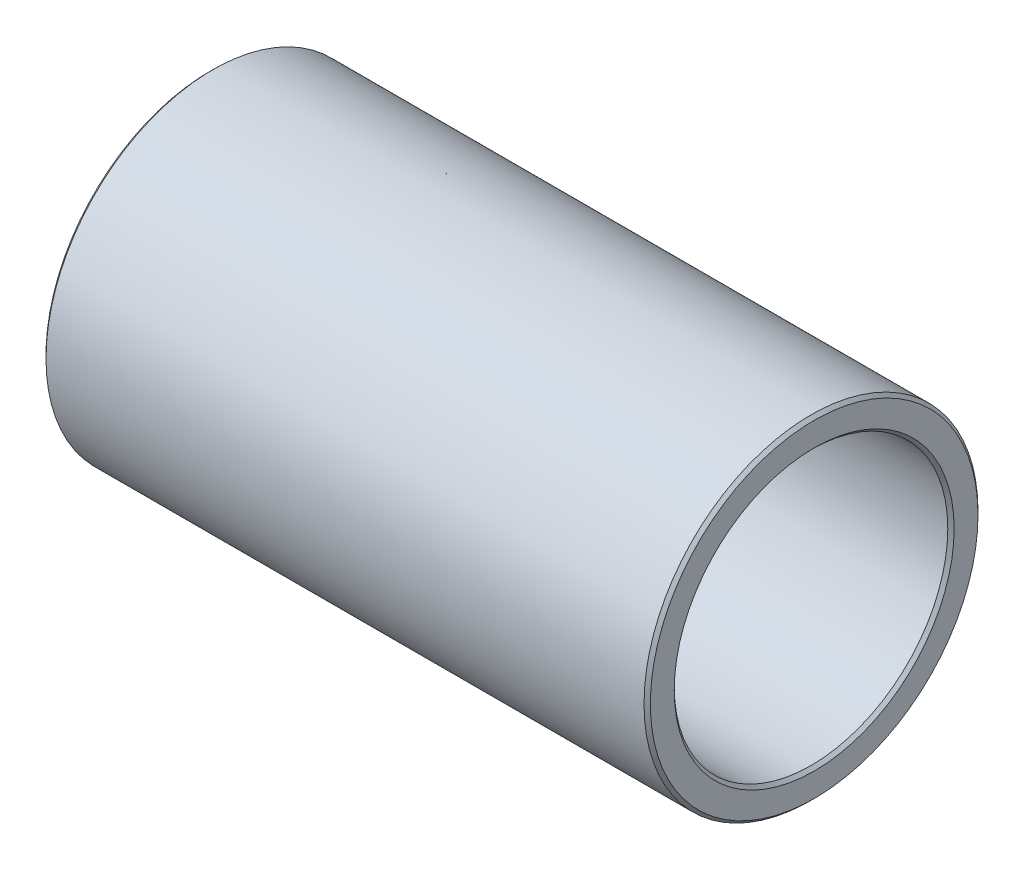
ISO-10303-21;
HEADER;
FILE_DESCRIPTION(('STEP AP214'),'2;1');
FILE_NAME('part.step','',(''),(''),'','','');
FILE_SCHEMA(('AUTOMOTIVE_DESIGN { 1 0 10303 214 1 1 1 1 }'));
ENDSEC;
DATA;
#1=APPLICATION_CONTEXT('core data for automotive mechanical design processes');
#2=APPLICATION_PROTOCOL_DEFINITION('international standard','automotive_design',2000,#1);
#3=PRODUCT_CONTEXT('',#1,'mechanical');
#4=PRODUCT('Part','Part','',(#3));
#5=PRODUCT_RELATED_PRODUCT_CATEGORY('part','',(#4));
#6=PRODUCT_DEFINITION_FORMATION('','',#4);
#7=PRODUCT_DEFINITION_CONTEXT('part definition',#1,'design');
#8=PRODUCT_DEFINITION('design','',#6,#7);
#9=PRODUCT_DEFINITION_SHAPE('','',#8);
#10=(LENGTH_UNIT() NAMED_UNIT(*) SI_UNIT(.MILLI.,.METRE.));
#11=(NAMED_UNIT(*) PLANE_ANGLE_UNIT() SI_UNIT($,.RADIAN.));
#12=(NAMED_UNIT(*) SI_UNIT($,.STERADIAN.) SOLID_ANGLE_UNIT());
#13=UNCERTAINTY_MEASURE_WITH_UNIT(LENGTH_MEASURE(1.E-05),#10,'distance_accuracy_value','');
#14=(GEOMETRIC_REPRESENTATION_CONTEXT(3) GLOBAL_UNCERTAINTY_ASSIGNED_CONTEXT((#13)) GLOBAL_UNIT_ASSIGNED_CONTEXT((#10,
#11,#12)) REPRESENTATION_CONTEXT('',''));
#15=CARTESIAN_POINT('',(0.,0.,0.));
#16=DIRECTION('',(0.,0.,1.));
#17=DIRECTION('',(1.,0.,0.));
#18=AXIS2_PLACEMENT_3D('',#15,#16,#17);
#19=CARTESIAN_POINT('',(9.79999999999993,-10.5,0.));
#20=DIRECTION('',(-1.,0.,0.));
#21=DIRECTION('',(0.,0.,1.));
#22=AXIS2_PLACEMENT_3D('',#19,#20,#21);
#23=PLANE('',#22);
#24=CARTESIAN_POINT('',(9.79999999999993,0.,0.));
#25=DIRECTION('',(-1.,0.,0.));
#26=DIRECTION('',(0.,0.,1.));
#27=AXIS2_PLACEMENT_3D('',#24,#25,#26);
#28=CIRCLE('',#27,8.79999999999999);
#29=CARTESIAN_POINT('',(9.79999999999993,0.,8.79999999999999));
#30=VERTEX_POINT('',#29);
#31=EDGE_CURVE('E54',#30,#30,#28,.F.);
#32=ORIENTED_EDGE('',*,*,#31,.T.);
#33=EDGE_LOOP('',(#32));
#34=FACE_BOUND('',#33,.T.);
#35=CARTESIAN_POINT('',(9.79999999999993,0.,0.));
#36=DIRECTION('',(-1.,0.,0.));
#37=DIRECTION('',(0.,0.,1.));
#38=AXIS2_PLACEMENT_3D('',#35,#36,#37);
#39=CIRCLE('',#38,10.3);
#40=CARTESIAN_POINT('',(9.79999999999993,0.,-10.3));
#41=VERTEX_POINT('',#40);
#42=EDGE_CURVE('E57',#41,#41,#39,.T.);
#43=ORIENTED_EDGE('',*,*,#42,.T.);
#44=EDGE_LOOP('',(#43));
#45=FACE_BOUND('',#44,.T.);
#46=ADVANCED_FACE('F33',(#34,#45),#23,.T.);
#47=CARTESIAN_POINT('',(-24.6710194165819,0.,0.));
#48=DIRECTION('',(-1.,0.,0.));
#49=DIRECTION('',(0.,0.,1.));
#50=AXIS2_PLACEMENT_3D('',#47,#48,#49);
#51=CYLINDRICAL_SURFACE('',#50,8.6);
#52=CARTESIAN_POINT('',(9.99999999999993,0.,0.));
#53=DIRECTION('',(-1.,0.,0.));
#54=DIRECTION('',(0.,0.,1.));
#55=AXIS2_PLACEMENT_3D('',#52,#53,#54);
#56=CIRCLE('',#55,8.6);
#57=CARTESIAN_POINT('',(9.99999999999993,0.,8.6));
#58=VERTEX_POINT('',#57);
#59=EDGE_CURVE('E60',#58,#58,#56,.T.);
#60=ORIENTED_EDGE('',*,*,#59,.T.);
#61=EDGE_LOOP('',(#60));
#62=FACE_BOUND('',#61,.T.);
#63=CARTESIAN_POINT('',(47.6004303095138,0.,0.));
#64=DIRECTION('',(1.,0.,0.));
#65=DIRECTION('',(0.,0.,-1.));
#66=AXIS2_PLACEMENT_3D('',#63,#64,#65);
#67=CIRCLE('',#66,8.6);
#68=CARTESIAN_POINT('',(47.6004303095138,0.,-8.6));
#69=VERTEX_POINT('',#68);
#70=EDGE_CURVE('E63',#69,#69,#67,.T.);
#71=ORIENTED_EDGE('',*,*,#70,.T.);
#72=EDGE_LOOP('',(#71));
#73=FACE_BOUND('',#72,.T.);
#74=ADVANCED_FACE('F67',(#62,#73),#51,.F.);
#75=CARTESIAN_POINT('',(47.8004303095138,-8.6,0.));
#76=DIRECTION('',(1.,0.,0.));
#77=DIRECTION('',(0.,0.,-1.));
#78=AXIS2_PLACEMENT_3D('',#75,#76,#77);
#79=PLANE('',#78);
#80=CARTESIAN_POINT('',(47.8004303095138,0.,0.));
#81=DIRECTION('',(1.,0.,0.));
#82=DIRECTION('',(0.,0.,-1.));
#83=AXIS2_PLACEMENT_3D('',#80,#81,#82);
#84=CIRCLE('',#83,10.3);
#85=CARTESIAN_POINT('',(47.8004303095138,0.,-10.3));
#86=VERTEX_POINT('',#85);
#87=EDGE_CURVE('E10',#86,#86,#84,.T.);
#88=ORIENTED_EDGE('',*,*,#87,.T.);
#89=EDGE_LOOP('',(#88));
#90=FACE_BOUND('',#89,.T.);
#91=CARTESIAN_POINT('',(47.8004303095138,0.,0.));
#92=DIRECTION('',(1.,0.,0.));
#93=DIRECTION('',(0.,0.,-1.));
#94=AXIS2_PLACEMENT_3D('',#91,#92,#93);
#95=CIRCLE('',#94,8.79999999999998);
#96=CARTESIAN_POINT('',(47.8004303095138,0.,-8.79999999999998));
#97=VERTEX_POINT('',#96);
#98=EDGE_CURVE('E41',#97,#97,#95,.F.);
#99=ORIENTED_EDGE('',*,*,#98,.T.);
#100=EDGE_LOOP('',(#99));
#101=FACE_BOUND('',#100,.T.);
#102=ADVANCED_FACE('F83',(#90,#101),#79,.T.);
#103=CARTESIAN_POINT('',(-24.6710194165819,0.,0.));
#104=DIRECTION('',(-1.,0.,0.));
#105=DIRECTION('',(0.,0.,1.));
#106=AXIS2_PLACEMENT_3D('',#103,#104,#105);
#107=CYLINDRICAL_SURFACE('',#106,10.5);
#108=CARTESIAN_POINT('',(9.9999999999999,0.,0.));
#109=DIRECTION('',(-1.,0.,0.));
#110=DIRECTION('',(0.,0.,1.));
#111=AXIS2_PLACEMENT_3D('',#108,#109,#110);
#112=CIRCLE('',#111,10.5);
#113=CARTESIAN_POINT('',(9.99999999999991,0.,-10.5));
#114=VERTEX_POINT('',#113);
#115=EDGE_CURVE('E45',#114,#114,#112,.F.);
#116=ORIENTED_EDGE('',*,*,#115,.T.);
#117=EDGE_LOOP('',(#116));
#118=FACE_BOUND('',#117,.T.);
#119=CARTESIAN_POINT('',(47.6004303095138,0.,0.));
#120=DIRECTION('',(1.,0.,0.));
#121=DIRECTION('',(0.,0.,-1.));
#122=AXIS2_PLACEMENT_3D('',#119,#120,#121);
#123=CIRCLE('',#122,10.5);
#124=CARTESIAN_POINT('',(47.6004303095138,0.,-10.5));
#125=VERTEX_POINT('',#124);
#126=EDGE_CURVE('E49',#125,#125,#123,.F.);
#127=ORIENTED_EDGE('',*,*,#126,.T.);
#128=EDGE_LOOP('',(#127));
#129=FACE_BOUND('',#128,.T.);
#130=ADVANCED_FACE('F96',(#118,#129),#107,.T.);
#131=CARTESIAN_POINT('',(9.99999999999993,0.,0.));
#132=DIRECTION('',(-1.,0.,0.));
#133=DIRECTION('',(0.,0.,1.));
#134=AXIS2_PLACEMENT_3D('',#131,#132,#133);
#135=CONICAL_SURFACE('',#134,8.6,0.785398163397444);
#136=ORIENTED_EDGE('',*,*,#31,.F.);
#137=EDGE_LOOP('',(#136));
#138=FACE_BOUND('',#137,.T.);
#139=ORIENTED_EDGE('',*,*,#59,.F.);
#140=EDGE_LOOP('',(#139));
#141=FACE_BOUND('',#140,.T.);
#142=ADVANCED_FACE('F90',(#138,#141),#135,.F.);
#143=CARTESIAN_POINT('',(9.79999999999993,0.,0.));
#144=DIRECTION('',(1.,0.,0.));
#145=DIRECTION('',(0.,0.,-1.));
#146=AXIS2_PLACEMENT_3D('',#143,#144,#145);
#147=CONICAL_SURFACE('',#146,10.3,0.78539816339744);
#148=CARTESIAN_POINT('',(9.99999999999991,0.,-10.5));
#149=CARTESIAN_POINT('',(9.99791666666657,0.,-10.4979166666667));
#150=CARTESIAN_POINT('',(9.99583333333324,0.,-10.4958333333333));
#151=CARTESIAN_POINT('',(9.99166666666657,0.,-10.4916666666667));
#152=CARTESIAN_POINT('',(9.98958333333324,0.,-10.4895833333333));
#153=CARTESIAN_POINT('',(9.98541666666658,0.,-10.4854166666667));
#154=CARTESIAN_POINT('',(9.98333333333324,0.,-10.4833333333333));
#155=CARTESIAN_POINT('',(9.97916666666658,0.,-10.4791666666667));
#156=CARTESIAN_POINT('',(9.97708333333324,0.,-10.4770833333333));
#157=CARTESIAN_POINT('',(9.97291666666658,0.,-10.4729166666667));
#158=CARTESIAN_POINT('',(9.97083333333324,0.,-10.4708333333333));
#159=CARTESIAN_POINT('',(9.96666666666658,0.,-10.4666666666667));
#160=CARTESIAN_POINT('',(9.96458333333324,0.,-10.4645833333333));
#161=CARTESIAN_POINT('',(9.96041666666658,0.,-10.4604166666667));
#162=CARTESIAN_POINT('',(9.95833333333325,0.,-10.4583333333333));
#163=CARTESIAN_POINT('',(9.95416666666658,0.,-10.4541666666667));
#164=CARTESIAN_POINT('',(9.95208333333325,0.,-10.4520833333333));
#165=CARTESIAN_POINT('',(9.94791666666658,0.,-10.4479166666667));
#166=CARTESIAN_POINT('',(9.94583333333325,0.,-10.4458333333333));
#167=CARTESIAN_POINT('',(9.94166666666658,0.,-10.4416666666667));
#168=CARTESIAN_POINT('',(9.93958333333325,0.,-10.4395833333333));
#169=CARTESIAN_POINT('',(9.93541666666658,0.,-10.4354166666667));
#170=CARTESIAN_POINT('',(9.93333333333325,0.,-10.4333333333333));
#171=CARTESIAN_POINT('',(9.92916666666658,0.,-10.4291666666667));
#172=CARTESIAN_POINT('',(9.92708333333325,0.,-10.4270833333333));
#173=CARTESIAN_POINT('',(9.92291666666658,0.,-10.4229166666667));
#174=CARTESIAN_POINT('',(9.92083333333325,0.,-10.4208333333333));
#175=CARTESIAN_POINT('',(9.91666666666658,0.,-10.4166666666667));
#176=CARTESIAN_POINT('',(9.91458333333325,0.,-10.4145833333333));
#177=CARTESIAN_POINT('',(9.91041666666658,0.,-10.4104166666667));
#178=CARTESIAN_POINT('',(9.90833333333325,0.,-10.4083333333333));
#179=CARTESIAN_POINT('',(9.90416666666658,0.,-10.4041666666667));
#180=CARTESIAN_POINT('',(9.90208333333325,0.,-10.4020833333333));
#181=CARTESIAN_POINT('',(9.89791666666659,0.,-10.3979166666667));
#182=CARTESIAN_POINT('',(9.89583333333325,0.,-10.3958333333333));
#183=CARTESIAN_POINT('',(9.89166666666659,0.,-10.3916666666667));
#184=CARTESIAN_POINT('',(9.88958333333325,0.,-10.3895833333333));
#185=CARTESIAN_POINT('',(9.88541666666659,0.,-10.3854166666667));
#186=CARTESIAN_POINT('',(9.88333333333325,0.,-10.3833333333333));
#187=CARTESIAN_POINT('',(9.87916666666659,0.,-10.3791666666667));
#188=CARTESIAN_POINT('',(9.87708333333326,0.,-10.3770833333333));
#189=CARTESIAN_POINT('',(9.87291666666659,0.,-10.3729166666667));
#190=CARTESIAN_POINT('',(9.87083333333326,0.,-10.3708333333333));
#191=CARTESIAN_POINT('',(9.86666666666659,0.,-10.3666666666667));
#192=CARTESIAN_POINT('',(9.86458333333326,0.,-10.3645833333333));
#193=CARTESIAN_POINT('',(9.86041666666659,0.,-10.3604166666667));
#194=CARTESIAN_POINT('',(9.85833333333326,0.,-10.3583333333333));
#195=CARTESIAN_POINT('',(9.85416666666659,0.,-10.3541666666667));
#196=CARTESIAN_POINT('',(9.85208333333326,0.,-10.3520833333333));
#197=CARTESIAN_POINT('',(9.84791666666659,0.,-10.3479166666667));
#198=CARTESIAN_POINT('',(9.84583333333326,0.,-10.3458333333333));
#199=CARTESIAN_POINT('',(9.84166666666659,0.,-10.3416666666667));
#200=CARTESIAN_POINT('',(9.83958333333326,0.,-10.3395833333333));
#201=CARTESIAN_POINT('',(9.83541666666659,0.,-10.3354166666667));
#202=CARTESIAN_POINT('',(9.83333333333326,0.,-10.3333333333333));
#203=CARTESIAN_POINT('',(9.82916666666659,0.,-10.3291666666667));
#204=CARTESIAN_POINT('',(9.82708333333326,0.,-10.3270833333334));
#205=CARTESIAN_POINT('',(9.8229166666666,0.,-10.3229166666667));
#206=CARTESIAN_POINT('',(9.82083333333326,0.,-10.3208333333334));
#207=CARTESIAN_POINT('',(9.8166666666666,0.,-10.3166666666667));
#208=CARTESIAN_POINT('',(9.81458333333326,0.,-10.3145833333334));
#209=CARTESIAN_POINT('',(9.8104166666666,0.,-10.3104166666667));
#210=CARTESIAN_POINT('',(9.80833333333326,0.,-10.3083333333334));
#211=CARTESIAN_POINT('',(9.8041666666666,0.,-10.3041666666667));
#212=CARTESIAN_POINT('',(9.80208333333326,0.,-10.3020833333334));
#213=CARTESIAN_POINT('',(9.79999999999993,0.,-10.3));
#214=B_SPLINE_CURVE_WITH_KNOTS('',3,(#148,#149,#150,#151,#152,#153,#154,#155,#156,#157,#158,
#159,#160,#161,#162,#163,#164,#165,#166,#167,#168,#169,#170,#171,#172,#173,#174,#175,#176,#177,
#178,#179,#180,#181,#182,#183,#184,#185,#186,#187,#188,#189,#190,#191,#192,#193,#194,#195,#196,
#197,#198,#199,#200,#201,#202,#203,#204,#205,#206,#207,#208,#209,#210,#211,#212,#213),
.UNSPECIFIED.,.F.,.F.,(4,2,2,2,2,2,2,2,2,2,2,2,2,2,2,2,2,2,2,2,2,2,2,2,2,2,2,2,2,2,2,2,4),(0.,
0.00883883476483087,0.0176776695296617,0.0265165042944926,0.0353553390593235,0.0441941738241543,
0.0530330085889852,0.0618718433538161,0.0707106781186457,0.0795495128834766,0.0883883476483075,
0.0972271824131383,0.106066017177969,0.1149048519428,0.123743686707631,0.132582521472462,
0.14142135623729,0.150260191002121,0.159099025766952,0.167937860531783,0.176776695296614,
0.185615530061445,0.194454364826276,0.203293199591106,0.212132034355937,0.220970869120767,
0.229809703885598,0.238648538650429,0.24748737341526,0.25632620818009,0.265165042944921,
0.274003877709752,0.282842712474583),.UNSPECIFIED.);
#215=EDGE_CURVE('BSEAM75',#114,#41,#214,.T.);
#216=ORIENTED_EDGE('',*,*,#115,.F.);
#217=ORIENTED_EDGE('',*,*,#42,.F.);
#218=ORIENTED_EDGE('',*,*,#215,.T.);
#219=ORIENTED_EDGE('',*,*,#215,.F.);
#220=EDGE_LOOP('',(#216,#218,#217,#219));
#221=FACE_BOUND('',#220,.T.);
#222=ADVANCED_FACE('F75',(#221),#147,.T.);
#223=CARTESIAN_POINT('',(47.6004303095138,0.,0.));
#224=DIRECTION('',(-1.,0.,0.));
#225=DIRECTION('',(0.,0.,1.));
#226=AXIS2_PLACEMENT_3D('',#223,#224,#225);
#227=CONICAL_SURFACE('',#226,10.5,0.785398163397414);
#228=ORIENTED_EDGE('',*,*,#87,.F.);
#229=EDGE_LOOP('',(#228));
#230=FACE_BOUND('',#229,.T.);
#231=ORIENTED_EDGE('',*,*,#126,.F.);
#232=EDGE_LOOP('',(#231));
#233=FACE_BOUND('',#232,.T.);
#234=ADVANCED_FACE('F71',(#230,#233),#227,.T.);
#235=CARTESIAN_POINT('',(47.8004303095138,0.,0.));
#236=DIRECTION('',(1.,0.,0.));
#237=DIRECTION('',(0.,0.,-1.));
#238=AXIS2_PLACEMENT_3D('',#235,#236,#237);
#239=CONICAL_SURFACE('',#238,8.79999999999999,0.785398163397418);
#240=ORIENTED_EDGE('',*,*,#70,.F.);
#241=EDGE_LOOP('',(#240));
#242=FACE_BOUND('',#241,.T.);
#243=ORIENTED_EDGE('',*,*,#98,.F.);
#244=EDGE_LOOP('',(#243));
#245=FACE_BOUND('',#244,.T.);
#246=ADVANCED_FACE('F36',(#242,#245),#239,.F.);
#247=CLOSED_SHELL('',(#46,#74,#102,#130,#142,#222,#234,#246));
#248=MANIFOLD_SOLID_BREP('B2',#247);
#249=ADVANCED_BREP_SHAPE_REPRESENTATION('',(#18,#248),#14);
#250=SHAPE_DEFINITION_REPRESENTATION(#9,#249);
ENDSEC;
END-ISO-10303-21;
